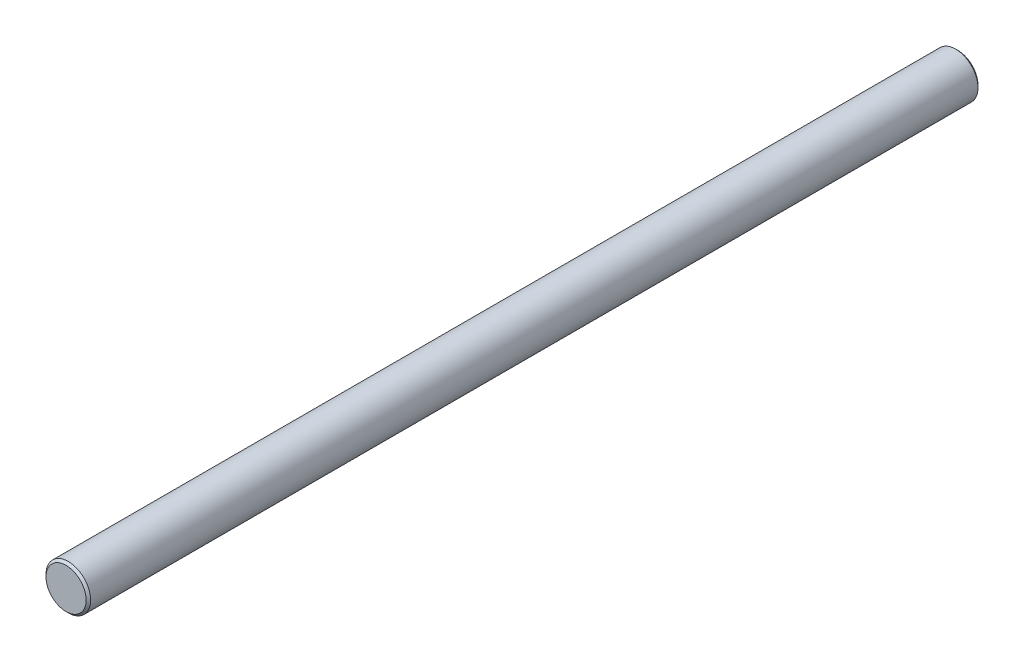
ISO-10303-21;
HEADER;
FILE_DESCRIPTION(('STEP AP214'),'2;1');
FILE_NAME('part.step','',(''),(''),'','','');
FILE_SCHEMA(('AUTOMOTIVE_DESIGN { 1 0 10303 214 1 1 1 1 }'));
ENDSEC;
DATA;
#1=APPLICATION_CONTEXT('core data for automotive mechanical design processes');
#2=APPLICATION_PROTOCOL_DEFINITION('international standard','automotive_design',2000,#1);
#3=PRODUCT_CONTEXT('',#1,'mechanical');
#4=PRODUCT('Part','Part','',(#3));
#5=PRODUCT_RELATED_PRODUCT_CATEGORY('part','',(#4));
#6=PRODUCT_DEFINITION_FORMATION('','',#4);
#7=PRODUCT_DEFINITION_CONTEXT('part definition',#1,'design');
#8=PRODUCT_DEFINITION('design','',#6,#7);
#9=PRODUCT_DEFINITION_SHAPE('','',#8);
#10=(LENGTH_UNIT() NAMED_UNIT(*) SI_UNIT(.MILLI.,.METRE.));
#11=(NAMED_UNIT(*) PLANE_ANGLE_UNIT() SI_UNIT($,.RADIAN.));
#12=(NAMED_UNIT(*) SI_UNIT($,.STERADIAN.) SOLID_ANGLE_UNIT());
#13=UNCERTAINTY_MEASURE_WITH_UNIT(LENGTH_MEASURE(1.E-05),#10,'distance_accuracy_value','');
#14=(GEOMETRIC_REPRESENTATION_CONTEXT(3) GLOBAL_UNCERTAINTY_ASSIGNED_CONTEXT((#13)) GLOBAL_UNIT_ASSIGNED_CONTEXT((#10,
#11,#12)) REPRESENTATION_CONTEXT('',''));
#15=CARTESIAN_POINT('',(0.,0.,0.));
#16=DIRECTION('',(0.,0.,1.));
#17=DIRECTION('',(1.,0.,0.));
#18=AXIS2_PLACEMENT_3D('',#15,#16,#17);
#19=CARTESIAN_POINT('',(0.,0.,60.));
#20=DIRECTION('',(0.,0.,-1.));
#21=DIRECTION('',(-1.,0.,0.));
#22=AXIS2_PLACEMENT_3D('',#19,#20,#21);
#23=CYLINDRICAL_SURFACE('',#22,3.);
#24=CARTESIAN_POINT('',(0.,0.,-59.7));
#25=DIRECTION('',(0.,0.,1.));
#26=DIRECTION('',(1.,0.,0.));
#27=AXIS2_PLACEMENT_3D('',#24,#25,#26);
#28=CIRCLE('',#27,3.);
#29=CARTESIAN_POINT('',(3.,0.,-59.7));
#30=VERTEX_POINT('',#29);
#31=EDGE_CURVE('E40',#30,#30,#28,.T.);
#32=ORIENTED_EDGE('',*,*,#31,.T.);
#33=EDGE_LOOP('',(#32));
#34=FACE_BOUND('',#33,.T.);
#35=CARTESIAN_POINT('',(0.,0.,59.7));
#36=DIRECTION('',(0.,0.,1.));
#37=DIRECTION('',(1.,0.,0.));
#38=AXIS2_PLACEMENT_3D('',#35,#36,#37);
#39=CIRCLE('',#38,3.);
#40=CARTESIAN_POINT('',(-3.,0.,59.7));
#41=VERTEX_POINT('',#40);
#42=EDGE_CURVE('E44',#41,#41,#39,.F.);
#43=ORIENTED_EDGE('',*,*,#42,.T.);
#44=EDGE_LOOP('',(#43));
#45=FACE_BOUND('',#44,.T.);
#46=ADVANCED_FACE('F32',(#34,#45),#23,.T.);
#47=CARTESIAN_POINT('',(0.,0.,60.));
#48=DIRECTION('',(0.,0.,1.));
#49=DIRECTION('',(1.,0.,0.));
#50=AXIS2_PLACEMENT_3D('',#47,#48,#49);
#51=PLANE('',#50);
#52=CARTESIAN_POINT('',(0.,0.,60.));
#53=DIRECTION('',(0.,0.,1.));
#54=DIRECTION('',(1.,0.,0.));
#55=AXIS2_PLACEMENT_3D('',#52,#53,#54);
#56=CIRCLE('',#55,2.70000000000004);
#57=CARTESIAN_POINT('',(-2.70000000000004,0.,60.));
#58=VERTEX_POINT('',#57);
#59=EDGE_CURVE('E48',#58,#58,#56,.T.);
#60=ORIENTED_EDGE('',*,*,#59,.T.);
#61=EDGE_LOOP('',(#60));
#62=FACE_BOUND('',#61,.T.);
#63=ADVANCED_FACE('F54',(#62),#51,.T.);
#64=CARTESIAN_POINT('',(0.,0.,-60.));
#65=DIRECTION('',(0.,0.,1.));
#66=DIRECTION('',(1.,0.,0.));
#67=AXIS2_PLACEMENT_3D('',#64,#65,#66);
#68=PLANE('',#67);
#69=CARTESIAN_POINT('',(0.,0.,-60.));
#70=DIRECTION('',(0.,0.,1.));
#71=DIRECTION('',(1.,0.,0.));
#72=AXIS2_PLACEMENT_3D('',#69,#70,#71);
#73=CIRCLE('',#72,2.70000000000002);
#74=CARTESIAN_POINT('',(2.70000000000002,0.,-60.));
#75=VERTEX_POINT('',#74);
#76=EDGE_CURVE('E10',#75,#75,#73,.F.);
#77=ORIENTED_EDGE('',*,*,#76,.T.);
#78=EDGE_LOOP('',(#77));
#79=FACE_BOUND('',#78,.T.);
#80=ADVANCED_FACE('F58',(#79),#68,.F.);
#81=CARTESIAN_POINT('',(0.,0.,60.));
#82=DIRECTION('',(0.,0.,-1.));
#83=DIRECTION('',(-1.,0.,0.));
#84=AXIS2_PLACEMENT_3D('',#81,#82,#83);
#85=CONICAL_SURFACE('',#84,2.70000000000004,0.785398163397433);
#86=CARTESIAN_POINT('',(-3.,0.,59.7));
#87=CARTESIAN_POINT('',(-2.996875,0.,59.703125));
#88=CARTESIAN_POINT('',(-2.99375,0.,59.70625));
#89=CARTESIAN_POINT('',(-2.98750000000001,0.,59.7125));
#90=CARTESIAN_POINT('',(-2.98437500000001,0.,59.715625));
#91=CARTESIAN_POINT('',(-2.97812500000001,0.,59.721875));
#92=CARTESIAN_POINT('',(-2.97500000000001,0.,59.725));
#93=CARTESIAN_POINT('',(-2.96875000000001,0.,59.73125));
#94=CARTESIAN_POINT('',(-2.96562500000001,0.,59.734375));
#95=CARTESIAN_POINT('',(-2.95937500000001,0.,59.740625));
#96=CARTESIAN_POINT('',(-2.95625000000001,0.,59.74375));
#97=CARTESIAN_POINT('',(-2.95000000000001,0.,59.75));
#98=CARTESIAN_POINT('',(-2.94687500000001,0.,59.753125));
#99=CARTESIAN_POINT('',(-2.94062500000001,0.,59.759375));
#100=CARTESIAN_POINT('',(-2.93750000000001,0.,59.7625));
#101=CARTESIAN_POINT('',(-2.93125000000001,0.,59.76875));
#102=CARTESIAN_POINT('',(-2.92812500000001,0.,59.771875));
#103=CARTESIAN_POINT('',(-2.92187500000001,0.,59.778125));
#104=CARTESIAN_POINT('',(-2.91875000000001,0.,59.78125));
#105=CARTESIAN_POINT('',(-2.91250000000001,0.,59.7875));
#106=CARTESIAN_POINT('',(-2.90937500000001,0.,59.790625));
#107=CARTESIAN_POINT('',(-2.90312500000002,0.,59.796875));
#108=CARTESIAN_POINT('',(-2.90000000000002,0.,59.8));
#109=CARTESIAN_POINT('',(-2.89375000000002,0.,59.80625));
#110=CARTESIAN_POINT('',(-2.89062500000002,0.,59.809375));
#111=CARTESIAN_POINT('',(-2.88437500000002,0.,59.815625));
#112=CARTESIAN_POINT('',(-2.88125000000002,0.,59.81875));
#113=CARTESIAN_POINT('',(-2.87500000000002,0.,59.825));
#114=CARTESIAN_POINT('',(-2.87187500000002,0.,59.828125));
#115=CARTESIAN_POINT('',(-2.86562500000002,0.,59.834375));
#116=CARTESIAN_POINT('',(-2.86250000000002,0.,59.8375));
#117=CARTESIAN_POINT('',(-2.85625000000002,0.,59.84375));
#118=CARTESIAN_POINT('',(-2.85312500000002,0.,59.846875));
#119=CARTESIAN_POINT('',(-2.84687500000002,0.,59.853125));
#120=CARTESIAN_POINT('',(-2.84375000000002,0.,59.85625));
#121=CARTESIAN_POINT('',(-2.83750000000002,0.,59.8625));
#122=CARTESIAN_POINT('',(-2.83437500000002,0.,59.865625));
#123=CARTESIAN_POINT('',(-2.82812500000002,0.,59.871875));
#124=CARTESIAN_POINT('',(-2.82500000000002,0.,59.875));
#125=CARTESIAN_POINT('',(-2.81875000000003,0.,59.88125));
#126=CARTESIAN_POINT('',(-2.81562500000003,0.,59.884375));
#127=CARTESIAN_POINT('',(-2.80937500000003,0.,59.890625));
#128=CARTESIAN_POINT('',(-2.80625000000003,0.,59.89375));
#129=CARTESIAN_POINT('',(-2.80000000000003,0.,59.9));
#130=CARTESIAN_POINT('',(-2.79687500000003,0.,59.903125));
#131=CARTESIAN_POINT('',(-2.79062500000003,0.,59.909375));
#132=CARTESIAN_POINT('',(-2.78750000000003,0.,59.9125));
#133=CARTESIAN_POINT('',(-2.78125000000003,0.,59.91875));
#134=CARTESIAN_POINT('',(-2.77812500000003,0.,59.921875));
#135=CARTESIAN_POINT('',(-2.77187500000003,0.,59.928125));
#136=CARTESIAN_POINT('',(-2.76875000000003,0.,59.93125));
#137=CARTESIAN_POINT('',(-2.76250000000003,0.,59.9375));
#138=CARTESIAN_POINT('',(-2.75937500000003,0.,59.940625));
#139=CARTESIAN_POINT('',(-2.75312500000003,0.,59.946875));
#140=CARTESIAN_POINT('',(-2.75000000000003,0.,59.95));
#141=CARTESIAN_POINT('',(-2.74375000000003,0.,59.95625));
#142=CARTESIAN_POINT('',(-2.74062500000003,0.,59.959375));
#143=CARTESIAN_POINT('',(-2.73437500000004,0.,59.965625));
#144=CARTESIAN_POINT('',(-2.73125000000004,0.,59.96875));
#145=CARTESIAN_POINT('',(-2.72500000000004,0.,59.975));
#146=CARTESIAN_POINT('',(-2.72187500000004,0.,59.978125));
#147=CARTESIAN_POINT('',(-2.71562500000004,0.,59.984375));
#148=CARTESIAN_POINT('',(-2.71250000000004,0.,59.9875));
#149=CARTESIAN_POINT('',(-2.70625000000004,0.,59.99375));
#150=CARTESIAN_POINT('',(-2.70312500000004,0.,59.996875));
#151=CARTESIAN_POINT('',(-2.70000000000004,0.,60.));
#152=B_SPLINE_CURVE_WITH_KNOTS('',3,(#86,#87,#88,#89,#90,#91,#92,#93,#94,#95,#96,#97,#98,#99,
#100,#101,#102,#103,#104,#105,#106,#107,#108,#109,#110,#111,#112,#113,#114,#115,#116,#117,#118,
#119,#120,#121,#122,#123,#124,#125,#126,#127,#128,#129,#130,#131,#132,#133,#134,#135,#136,#137,
#138,#139,#140,#141,#142,#143,#144,#145,#146,#147,#148,#149,#150,#151),.UNSPECIFIED.,.F.,.F.,(4,
2,2,2,2,2,2,2,2,2,2,2,2,2,2,2,2,2,2,2,2,2,2,2,2,2,2,2,2,2,2,2,4),(0.,0.0132582521472463,
0.0265165042944926,0.0397747564417386,0.0530330085889849,0.0662912607362312,0.0795495128834775,
0.0928077650307238,0.10606601717797,0.119324269325216,0.132582521472462,0.145840773619709,
0.159099025766955,0.172357277914201,0.185615530061448,0.198873782208694,0.21213203435594,
0.225390286503186,0.238648538650433,0.251906790797679,0.265165042944925,0.278423295092171,
0.291681547239418,0.304939799386664,0.31819805153391,0.331456303681156,0.344714555828403,
0.357972807975649,0.371231060122895,0.384489312270141,0.397747564417388,0.411005816564634,
0.424264068711885),.UNSPECIFIED.);
#153=EDGE_CURVE('BSEAM56',#41,#58,#152,.T.);
#154=ORIENTED_EDGE('',*,*,#42,.F.);
#155=ORIENTED_EDGE('',*,*,#59,.F.);
#156=ORIENTED_EDGE('',*,*,#153,.T.);
#157=ORIENTED_EDGE('',*,*,#153,.F.);
#158=EDGE_LOOP('',(#154,#156,#155,#157));
#159=FACE_BOUND('',#158,.T.);
#160=ADVANCED_FACE('F56',(#159),#85,.T.);
#161=CARTESIAN_POINT('',(0.,0.,-59.7));
#162=DIRECTION('',(0.,0.,1.));
#163=DIRECTION('',(1.,0.,0.));
#164=AXIS2_PLACEMENT_3D('',#161,#162,#163);
#165=CONICAL_SURFACE('',#164,3.,0.785398163397422);
#166=ORIENTED_EDGE('',*,*,#76,.F.);
#167=EDGE_LOOP('',(#166));
#168=FACE_BOUND('',#167,.T.);
#169=ORIENTED_EDGE('',*,*,#31,.F.);
#170=EDGE_LOOP('',(#169));
#171=FACE_BOUND('',#170,.T.);
#172=ADVANCED_FACE('F35',(#168,#171),#165,.T.);
#173=CLOSED_SHELL('',(#46,#63,#80,#160,#172));
#174=MANIFOLD_SOLID_BREP('B2',#173);
#175=ADVANCED_BREP_SHAPE_REPRESENTATION('',(#18,#174),#14);
#176=SHAPE_DEFINITION_REPRESENTATION(#9,#175);
ENDSEC;
END-ISO-10303-21;
